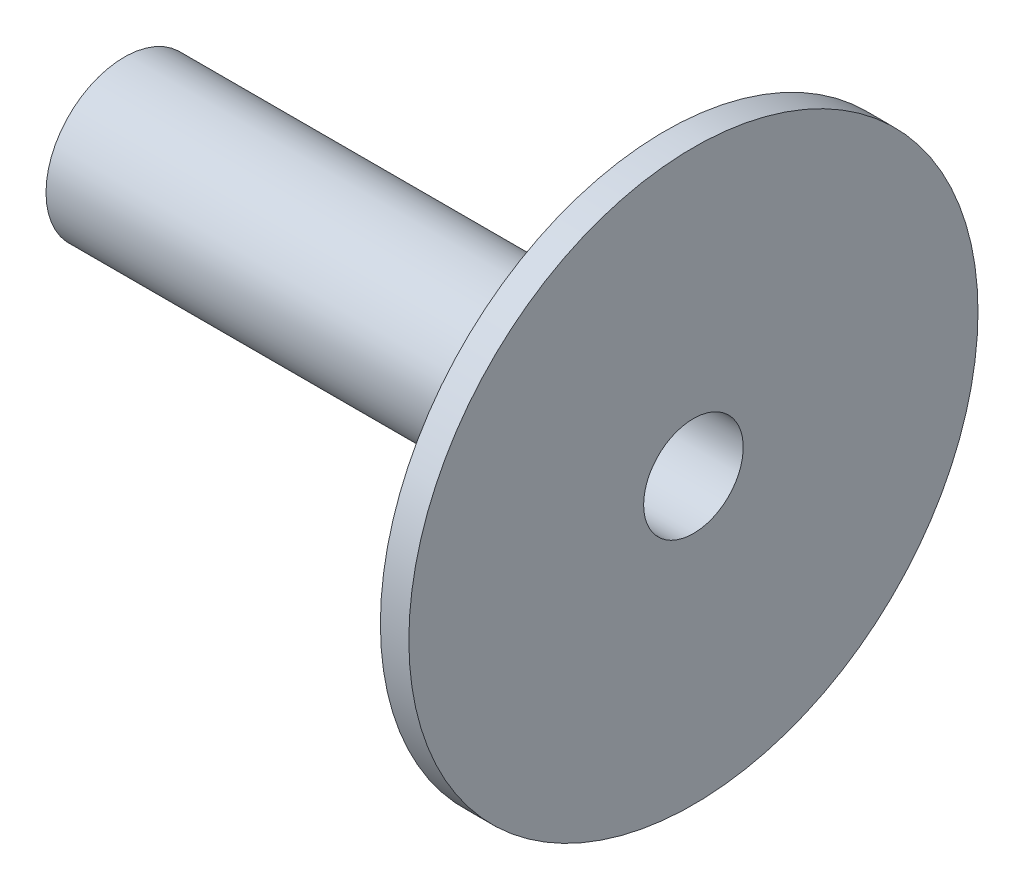
ISO-10303-21;
HEADER;
FILE_DESCRIPTION(('STEP AP214'),'2;1');
FILE_NAME('part.step','',(''),(''),'','','');
FILE_SCHEMA(('AUTOMOTIVE_DESIGN { 1 0 10303 214 1 1 1 1 }'));
ENDSEC;
DATA;
#1=APPLICATION_CONTEXT('core data for automotive mechanical design processes');
#2=APPLICATION_PROTOCOL_DEFINITION('international standard','automotive_design',2000,#1);
#3=PRODUCT_CONTEXT('',#1,'mechanical');
#4=PRODUCT('Part','Part','',(#3));
#5=PRODUCT_RELATED_PRODUCT_CATEGORY('part','',(#4));
#6=PRODUCT_DEFINITION_FORMATION('','',#4);
#7=PRODUCT_DEFINITION_CONTEXT('part definition',#1,'design');
#8=PRODUCT_DEFINITION('design','',#6,#7);
#9=PRODUCT_DEFINITION_SHAPE('','',#8);
#10=(LENGTH_UNIT() NAMED_UNIT(*) SI_UNIT(.MILLI.,.METRE.));
#11=(NAMED_UNIT(*) PLANE_ANGLE_UNIT() SI_UNIT($,.RADIAN.));
#12=(NAMED_UNIT(*) SI_UNIT($,.STERADIAN.) SOLID_ANGLE_UNIT());
#13=UNCERTAINTY_MEASURE_WITH_UNIT(LENGTH_MEASURE(1.E-05),#10,'distance_accuracy_value','');
#14=(GEOMETRIC_REPRESENTATION_CONTEXT(3) GLOBAL_UNCERTAINTY_ASSIGNED_CONTEXT((#13)) GLOBAL_UNIT_ASSIGNED_CONTEXT((#10,
#11,#12)) REPRESENTATION_CONTEXT('',''));
#15=CARTESIAN_POINT('',(0.,0.,0.));
#16=DIRECTION('',(0.,0.,1.));
#17=DIRECTION('',(1.,0.,0.));
#18=AXIS2_PLACEMENT_3D('',#15,#16,#17);
#19=CARTESIAN_POINT('',(40.,0.,0.));
#20=DIRECTION('',(-1.,0.,0.));
#21=DIRECTION('',(0.,0.,1.));
#22=AXIS2_PLACEMENT_3D('',#19,#20,#21);
#23=CYLINDRICAL_SURFACE('',#22,20.);
#24=CARTESIAN_POINT('',(40.,0.,0.));
#25=DIRECTION('',(1.,0.,0.));
#26=DIRECTION('',(0.,0.,-1.));
#27=AXIS2_PLACEMENT_3D('',#24,#25,#26);
#28=CIRCLE('',#27,20.);
#29=CARTESIAN_POINT('',(40.,0.,-20.));
#30=VERTEX_POINT('',#29);
#31=EDGE_CURVE('E10',#30,#30,#28,.T.);
#32=ORIENTED_EDGE('',*,*,#31,.F.);
#33=EDGE_LOOP('',(#32));
#34=FACE_BOUND('',#33,.T.);
#35=CARTESIAN_POINT('',(38.,0.,0.));
#36=DIRECTION('',(-1.,0.,0.));
#37=DIRECTION('',(0.,0.,1.));
#38=AXIS2_PLACEMENT_3D('',#35,#36,#37);
#39=CIRCLE('',#38,20.);
#40=CARTESIAN_POINT('',(38.,0.,20.));
#41=VERTEX_POINT('',#40);
#42=EDGE_CURVE('E36',#41,#41,#39,.T.);
#43=ORIENTED_EDGE('',*,*,#42,.F.);
#44=EDGE_LOOP('',(#43));
#45=FACE_BOUND('',#44,.T.);
#46=ADVANCED_FACE('F30',(#34,#45),#23,.T.);
#47=CARTESIAN_POINT('',(40.,0.,0.));
#48=DIRECTION('',(1.,0.,0.));
#49=DIRECTION('',(0.,0.,-1.));
#50=AXIS2_PLACEMENT_3D('',#47,#48,#49);
#51=PLANE('',#50);
#52=CARTESIAN_POINT('',(40.,0.,0.));
#53=DIRECTION('',(-1.,0.,0.));
#54=DIRECTION('',(0.,0.,1.));
#55=AXIS2_PLACEMENT_3D('',#52,#53,#54);
#56=CIRCLE('',#55,3.5);
#57=CARTESIAN_POINT('',(40.,0.,3.5));
#58=VERTEX_POINT('',#57);
#59=EDGE_CURVE('E48',#58,#58,#56,.T.);
#60=ORIENTED_EDGE('',*,*,#59,.T.);
#61=EDGE_LOOP('',(#60));
#62=FACE_BOUND('',#61,.T.);
#63=ORIENTED_EDGE('',*,*,#31,.T.);
#64=EDGE_LOOP('',(#63));
#65=FACE_BOUND('',#64,.T.);
#66=ADVANCED_FACE('F56',(#62,#65),#51,.T.);
#67=CARTESIAN_POINT('',(38.,0.,0.));
#68=DIRECTION('',(-1.,0.,0.));
#69=DIRECTION('',(0.,0.,1.));
#70=AXIS2_PLACEMENT_3D('',#67,#68,#69);
#71=PLANE('',#70);
#72=CARTESIAN_POINT('',(38.,0.,0.));
#73=DIRECTION('',(-1.,0.,0.));
#74=DIRECTION('',(0.,0.,1.));
#75=AXIS2_PLACEMENT_3D('',#72,#73,#74);
#76=CIRCLE('',#75,5.5);
#77=CARTESIAN_POINT('',(38.,0.,5.5));
#78=VERTEX_POINT('',#77);
#79=EDGE_CURVE('E40',#78,#78,#76,.T.);
#80=ORIENTED_EDGE('',*,*,#79,.F.);
#81=EDGE_LOOP('',(#80));
#82=FACE_BOUND('',#81,.T.);
#83=ORIENTED_EDGE('',*,*,#42,.T.);
#84=EDGE_LOOP('',(#83));
#85=FACE_BOUND('',#84,.T.);
#86=ADVANCED_FACE('F71',(#82,#85),#71,.T.);
#87=CARTESIAN_POINT('',(38.,0.,0.));
#88=DIRECTION('',(-1.,0.,0.));
#89=DIRECTION('',(0.,0.,1.));
#90=AXIS2_PLACEMENT_3D('',#87,#88,#89);
#91=CYLINDRICAL_SURFACE('',#90,5.5);
#92=ORIENTED_EDGE('',*,*,#79,.T.);
#93=EDGE_LOOP('',(#92));
#94=FACE_BOUND('',#93,.T.);
#95=CARTESIAN_POINT('',(0.,0.,0.));
#96=DIRECTION('',(-1.,0.,0.));
#97=DIRECTION('',(0.,0.,1.));
#98=AXIS2_PLACEMENT_3D('',#95,#96,#97);
#99=CIRCLE('',#98,5.5);
#100=CARTESIAN_POINT('',(0.,0.,5.5));
#101=VERTEX_POINT('',#100);
#102=EDGE_CURVE('E44',#101,#101,#99,.T.);
#103=ORIENTED_EDGE('',*,*,#102,.F.);
#104=EDGE_LOOP('',(#103));
#105=FACE_BOUND('',#104,.T.);
#106=ADVANCED_FACE('F67',(#94,#105),#91,.T.);
#107=CARTESIAN_POINT('',(0.,0.,0.));
#108=DIRECTION('',(1.,0.,0.));
#109=DIRECTION('',(0.,0.,-1.));
#110=AXIS2_PLACEMENT_3D('',#107,#108,#109);
#111=PLANE('',#110);
#112=CARTESIAN_POINT('',(0.,0.,0.));
#113=DIRECTION('',(-1.,0.,0.));
#114=DIRECTION('',(0.,0.,1.));
#115=AXIS2_PLACEMENT_3D('',#112,#113,#114);
#116=CIRCLE('',#115,3.5);
#117=CARTESIAN_POINT('',(0.,0.,3.5));
#118=VERTEX_POINT('',#117);
#119=EDGE_CURVE('E50',#118,#118,#116,.T.);
#120=ORIENTED_EDGE('',*,*,#119,.F.);
#121=EDGE_LOOP('',(#120));
#122=FACE_BOUND('',#121,.T.);
#123=ORIENTED_EDGE('',*,*,#102,.T.);
#124=EDGE_LOOP('',(#123));
#125=FACE_BOUND('',#124,.T.);
#126=ADVANCED_FACE('F61',(#122,#125),#111,.F.);
#127=CARTESIAN_POINT('',(40.,0.,0.));
#128=DIRECTION('',(-1.,0.,0.));
#129=DIRECTION('',(0.,0.,1.));
#130=AXIS2_PLACEMENT_3D('',#127,#128,#129);
#131=CYLINDRICAL_SURFACE('',#130,3.5);
#132=ORIENTED_EDGE('',*,*,#59,.F.);
#133=EDGE_LOOP('',(#132));
#134=FACE_BOUND('',#133,.T.);
#135=ORIENTED_EDGE('',*,*,#119,.T.);
#136=EDGE_LOOP('',(#135));
#137=FACE_BOUND('',#136,.T.);
#138=ADVANCED_FACE('F58',(#134,#137),#131,.F.);
#139=CLOSED_SHELL('',(#46,#66,#86,#106,#126,#138));
#140=MANIFOLD_SOLID_BREP('B2',#139);
#141=ADVANCED_BREP_SHAPE_REPRESENTATION('',(#18,#140),#14);
#142=SHAPE_DEFINITION_REPRESENTATION(#9,#141);
ENDSEC;
END-ISO-10303-21;
